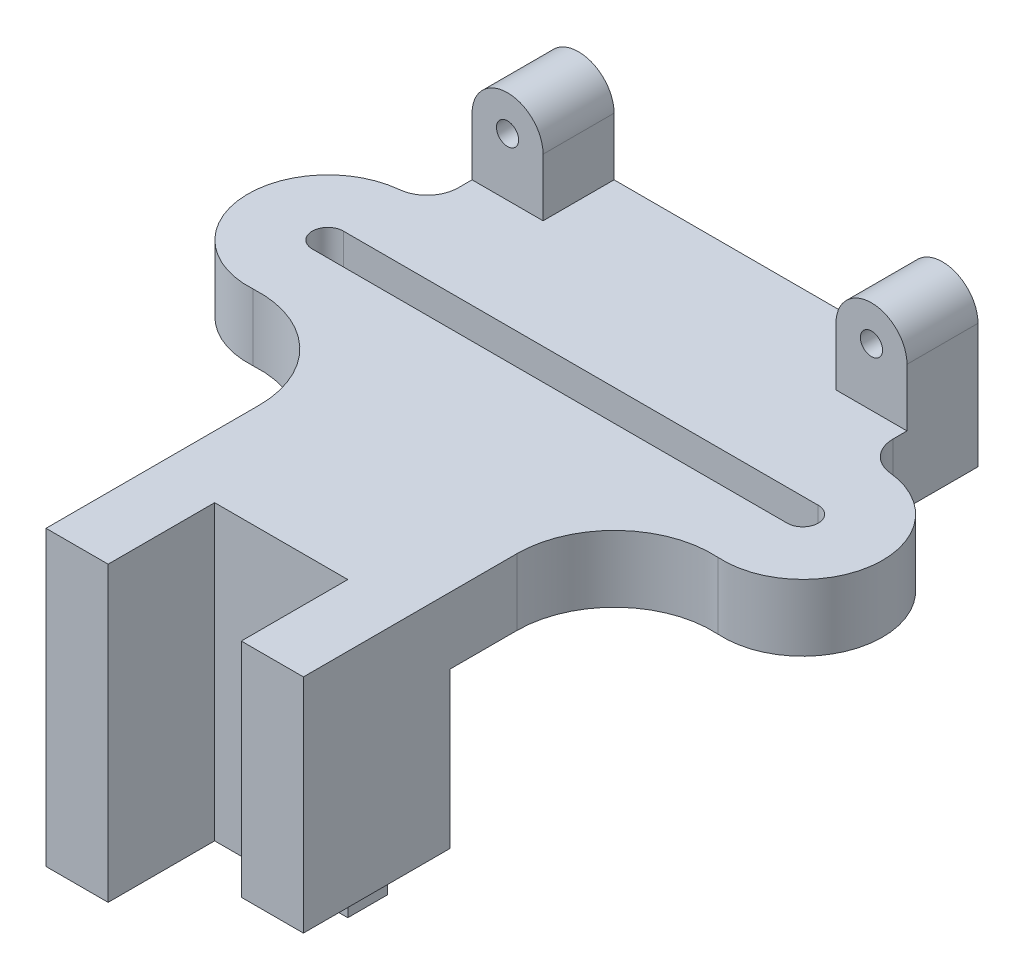
ISO-10303-21;
HEADER;
FILE_DESCRIPTION(('STEP AP214'),'2;1');
FILE_NAME('part.step','',(''),(''),'','','');
FILE_SCHEMA(('AUTOMOTIVE_DESIGN { 1 0 10303 214 1 1 1 1 }'));
ENDSEC;
DATA;
#1=APPLICATION_CONTEXT('core data for automotive mechanical design processes');
#2=APPLICATION_PROTOCOL_DEFINITION('international standard','automotive_design',2000,#1);
#3=PRODUCT_CONTEXT('',#1,'mechanical');
#4=PRODUCT('Part','Part','',(#3));
#5=PRODUCT_RELATED_PRODUCT_CATEGORY('part','',(#4));
#6=PRODUCT_DEFINITION_FORMATION('','',#4);
#7=PRODUCT_DEFINITION_CONTEXT('part definition',#1,'design');
#8=PRODUCT_DEFINITION('design','',#6,#7);
#9=PRODUCT_DEFINITION_SHAPE('','',#8);
#10=(LENGTH_UNIT() NAMED_UNIT(*) SI_UNIT(.MILLI.,.METRE.));
#11=(NAMED_UNIT(*) PLANE_ANGLE_UNIT() SI_UNIT($,.RADIAN.));
#12=(NAMED_UNIT(*) SI_UNIT($,.STERADIAN.) SOLID_ANGLE_UNIT());
#13=UNCERTAINTY_MEASURE_WITH_UNIT(LENGTH_MEASURE(1.E-05),#10,'distance_accuracy_value','');
#14=(GEOMETRIC_REPRESENTATION_CONTEXT(3) GLOBAL_UNCERTAINTY_ASSIGNED_CONTEXT((#13)) GLOBAL_UNIT_ASSIGNED_CONTEXT((#10,
#11,#12)) REPRESENTATION_CONTEXT('',''));
#15=CARTESIAN_POINT('',(0.,0.,0.));
#16=DIRECTION('',(0.,0.,1.));
#17=DIRECTION('',(1.,0.,0.));
#18=AXIS2_PLACEMENT_3D('',#15,#16,#17);
#19=CARTESIAN_POINT('',(15.,15.,132.));
#20=DIRECTION('',(0.,0.,-1.));
#21=DIRECTION('',(-1.,0.,0.));
#22=AXIS2_PLACEMENT_3D('',#19,#20,#21);
#23=PLANE('',#22);
#24=DIRECTION('',(-1.,0.,0.));
#25=VECTOR('',#24,1.);
#26=CARTESIAN_POINT('',(15.,-35.,132.));
#27=LINE('',#26,#25);
#28=CARTESIAN_POINT('',(29.,-35.,132.));
#29=VERTEX_POINT('',#28);
#30=CARTESIAN_POINT('',(15.,-35.,132.));
#31=VERTEX_POINT('',#30);
#32=EDGE_CURVE('E240',#29,#31,#27,.T.);
#33=ORIENTED_EDGE('',*,*,#32,.F.);
#34=DIRECTION('',(0.,-1.,0.));
#35=VECTOR('',#34,1.);
#36=CARTESIAN_POINT('',(29.,15.,132.));
#37=LINE('',#36,#35);
#38=CARTESIAN_POINT('',(29.,15.,132.));
#39=VERTEX_POINT('',#38);
#40=EDGE_CURVE('E261',#39,#29,#37,.T.);
#41=ORIENTED_EDGE('',*,*,#40,.F.);
#42=DIRECTION('',(1.,0.,0.));
#43=VECTOR('',#42,1.);
#44=CARTESIAN_POINT('',(15.,15.,132.));
#45=LINE('',#44,#43);
#46=CARTESIAN_POINT('',(15.,15.,132.));
#47=VERTEX_POINT('',#46);
#48=EDGE_CURVE('E257',#47,#39,#45,.T.);
#49=ORIENTED_EDGE('',*,*,#48,.F.);
#50=DIRECTION('',(0.,-1.,0.));
#51=VECTOR('',#50,1.);
#52=CARTESIAN_POINT('',(15.,15.,132.));
#53=LINE('',#52,#51);
#54=EDGE_CURVE('E254',#47,#31,#53,.T.);
#55=ORIENTED_EDGE('',*,*,#54,.T.);
#56=EDGE_LOOP('',(#33,#41,#49,#55));
#57=FACE_BOUND('',#56,.T.);
#58=ADVANCED_FACE('F41',(#57),#23,.F.);
#59=CARTESIAN_POINT('',(0.,-51.,0.));
#60=DIRECTION('',(0.,-1.,0.));
#61=DIRECTION('',(0.,0.,-1.));
#62=AXIS2_PLACEMENT_3D('',#59,#60,#61);
#63=PLANE('',#62);
#64=DIRECTION('',(1.,0.,0.));
#65=VECTOR('',#64,1.);
#66=CARTESIAN_POINT('',(29.,-51.,99.));
#67=LINE('',#66,#65);
#68=CARTESIAN_POINT('',(-29.,-51.,99.));
#69=VERTEX_POINT('',#68);
#70=CARTESIAN_POINT('',(15.,-51.,99.));
#71=VERTEX_POINT('',#70);
#72=EDGE_CURVE('E306',#69,#71,#67,.T.);
#73=ORIENTED_EDGE('',*,*,#72,.T.);
#74=DIRECTION('',(0.,0.,1.));
#75=VECTOR('',#74,1.);
#76=CARTESIAN_POINT('',(15.,-51.,0.));
#77=LINE('',#76,#75);
#78=CARTESIAN_POINT('',(15.,-51.,108.));
#79=VERTEX_POINT('',#78);
#80=EDGE_CURVE('E246',#71,#79,#77,.T.);
#81=ORIENTED_EDGE('',*,*,#80,.T.);
#82=DIRECTION('',(-1.,0.,0.));
#83=VECTOR('',#82,1.);
#84=CARTESIAN_POINT('',(-15.,-51.,108.));
#85=LINE('',#84,#83);
#86=CARTESIAN_POINT('',(-15.,-51.,108.));
#87=VERTEX_POINT('',#86);
#88=EDGE_CURVE('E302',#79,#87,#85,.T.);
#89=ORIENTED_EDGE('',*,*,#88,.T.);
#90=DIRECTION('',(0.,0.,1.));
#91=VECTOR('',#90,1.);
#92=CARTESIAN_POINT('',(-15.,-51.,132.));
#93=LINE('',#92,#91);
#94=CARTESIAN_POINT('',(-15.,-51.,132.));
#95=VERTEX_POINT('',#94);
#96=EDGE_CURVE('E321',#87,#95,#93,.T.);
#97=ORIENTED_EDGE('',*,*,#96,.T.);
#98=DIRECTION('',(-1.,0.,0.));
#99=VECTOR('',#98,1.);
#100=CARTESIAN_POINT('',(-29.,-51.,132.));
#101=LINE('',#100,#99);
#102=CARTESIAN_POINT('',(-29.,-51.,132.));
#103=VERTEX_POINT('',#102);
#104=EDGE_CURVE('E894',#95,#103,#101,.T.);
#105=ORIENTED_EDGE('',*,*,#104,.T.);
#106=DIRECTION('',(0.,0.,-1.));
#107=VECTOR('',#106,1.);
#108=CARTESIAN_POINT('',(-29.,-51.,99.));
#109=LINE('',#108,#107);
#110=EDGE_CURVE('E320',#103,#69,#109,.T.);
#111=ORIENTED_EDGE('',*,*,#110,.T.);
#112=EDGE_LOOP('',(#73,#81,#89,#97,#105,#111));
#113=FACE_BOUND('',#112,.T.);
#114=ADVANCED_FACE('F301',(#113),#63,.T.);
#115=CARTESIAN_POINT('',(29.,15.,132.));
#116=DIRECTION('',(-1.,0.,0.));
#117=DIRECTION('',(0.,0.,1.));
#118=AXIS2_PLACEMENT_3D('',#115,#116,#117);
#119=PLANE('',#118);
#120=DIRECTION('',(0.,0.,1.));
#121=VECTOR('',#120,1.);
#122=CARTESIAN_POINT('',(29.,-35.,0.));
#123=LINE('',#122,#121);
#124=CARTESIAN_POINT('',(29.,-35.,99.));
#125=VERTEX_POINT('',#124);
#126=EDGE_CURVE('E242',#125,#29,#123,.T.);
#127=ORIENTED_EDGE('',*,*,#126,.F.);
#128=DIRECTION('',(0.,1.,0.));
#129=VECTOR('',#128,1.);
#130=CARTESIAN_POINT('',(29.,-51.,99.));
#131=LINE('',#130,#129);
#132=CARTESIAN_POINT('',(29.,0.,99.));
#133=VERTEX_POINT('',#132);
#134=EDGE_CURVE('E311',#125,#133,#131,.T.);
#135=ORIENTED_EDGE('',*,*,#134,.T.);
#136=DIRECTION('',(0.,0.,-1.));
#137=VECTOR('',#136,1.);
#138=CARTESIAN_POINT('',(29.,0.,132.));
#139=LINE('',#138,#137);
#140=CARTESIAN_POINT('',(29.,0.,83.9217985566783));
#141=VERTEX_POINT('',#140);
#142=EDGE_CURVE('E461',#133,#141,#139,.T.);
#143=ORIENTED_EDGE('',*,*,#142,.T.);
#144=DIRECTION('',(0.,-1.,0.));
#145=VECTOR('',#144,1.);
#146=CARTESIAN_POINT('',(29.,15.,83.9217985566783));
#147=LINE('',#146,#145);
#148=CARTESIAN_POINT('',(29.,15.,83.9217985566783));
#149=VERTEX_POINT('',#148);
#150=EDGE_CURVE('E264',#149,#141,#147,.T.);
#151=ORIENTED_EDGE('',*,*,#150,.F.);
#152=DIRECTION('',(0.,0.,-1.));
#153=VECTOR('',#152,1.);
#154=CARTESIAN_POINT('',(29.,15.,132.));
#155=LINE('',#154,#153);
#156=EDGE_CURVE('E440',#39,#149,#155,.T.);
#157=ORIENTED_EDGE('',*,*,#156,.F.);
#158=ORIENTED_EDGE('',*,*,#40,.T.);
#159=EDGE_LOOP('',(#127,#135,#143,#151,#157,#158));
#160=FACE_BOUND('',#159,.T.);
#161=ADVANCED_FACE('F512',(#160),#119,.F.);
#162=CARTESIAN_POINT('',(-56.,15.,19.1253140723345));
#163=DIRECTION('',(0.,-1.,0.));
#164=DIRECTION('',(0.,0.,-1.));
#165=AXIS2_PLACEMENT_3D('',#162,#163,#164);
#166=PLANE('',#165);
#167=CARTESIAN_POINT('',(-53.5,15.,44.));
#168=DIRECTION('',(0.,1.,0.));
#169=DIRECTION('',(0.,0.,1.));
#170=AXIS2_PLACEMENT_3D('',#167,#168,#169);
#171=CIRCLE('',#170,3.5);
#172=CARTESIAN_POINT('',(-53.5,15.,40.5));
#173=VERTEX_POINT('',#172);
#174=CARTESIAN_POINT('',(-53.5,15.,47.5));
#175=VERTEX_POINT('',#174);
#176=EDGE_CURVE('E387',#173,#175,#171,.T.);
#177=ORIENTED_EDGE('',*,*,#176,.F.);
#178=DIRECTION('',(-1.,0.,0.));
#179=VECTOR('',#178,1.);
#180=CARTESIAN_POINT('',(-53.5,15.,40.5));
#181=LINE('',#180,#179);
#182=CARTESIAN_POINT('',(53.5,15.,40.5));
#183=VERTEX_POINT('',#182);
#184=EDGE_CURVE('E393',#183,#173,#181,.T.);
#185=ORIENTED_EDGE('',*,*,#184,.F.);
#186=CARTESIAN_POINT('',(53.5,15.,44.));
#187=DIRECTION('',(0.,1.,0.));
#188=DIRECTION('',(0.,0.,1.));
#189=AXIS2_PLACEMENT_3D('',#186,#187,#188);
#190=CIRCLE('',#189,3.50000000000001);
#191=CARTESIAN_POINT('',(53.5,15.,47.5));
#192=VERTEX_POINT('',#191);
#193=EDGE_CURVE('E391',#192,#183,#190,.T.);
#194=ORIENTED_EDGE('',*,*,#193,.F.);
#195=DIRECTION('',(1.,0.,0.));
#196=VECTOR('',#195,1.);
#197=CARTESIAN_POINT('',(-53.5,15.,47.5));
#198=LINE('',#197,#196);
#199=EDGE_CURVE('E389',#175,#192,#198,.T.);
#200=ORIENTED_EDGE('',*,*,#199,.F.);
#201=EDGE_LOOP('',(#177,#185,#194,#200));
#202=FACE_BOUND('',#201,.T.);
#203=DIRECTION('',(0.,0.,-1.));
#204=VECTOR('',#203,1.);
#205=CARTESIAN_POINT('',(-33.,15.,16.));
#206=LINE('',#205,#204);
#207=CARTESIAN_POINT('',(-33.,15.,16.));
#208=VERTEX_POINT('',#207);
#209=CARTESIAN_POINT('',(-33.,15.,0.));
#210=VERTEX_POINT('',#209);
#211=EDGE_CURVE('E355',#208,#210,#206,.T.);
#212=ORIENTED_EDGE('',*,*,#211,.F.);
#213=DIRECTION('',(1.,0.,0.));
#214=VECTOR('',#213,1.);
#215=CARTESIAN_POINT('',(-33.,15.,16.));
#216=LINE('',#215,#214);
#217=CARTESIAN_POINT('',(-49.,15.,16.));
#218=VERTEX_POINT('',#217);
#219=EDGE_CURVE('E333',#218,#208,#216,.T.);
#220=ORIENTED_EDGE('',*,*,#219,.F.);
#221=DIRECTION('',(0.,0.,1.));
#222=VECTOR('',#221,1.);
#223=CARTESIAN_POINT('',(-49.,15.,0.));
#224=LINE('',#223,#222);
#225=CARTESIAN_POINT('',(-49.,15.,19.1253140723345));
#226=VERTEX_POINT('',#225);
#227=EDGE_CURVE('E417',#218,#226,#224,.T.);
#228=ORIENTED_EDGE('',*,*,#227,.T.);
#229=CARTESIAN_POINT('',(-56.,15.,19.1253140723345));
#230=DIRECTION('',(0.,-1.,0.));
#231=DIRECTION('',(0.,0.,-1.));
#232=AXIS2_PLACEMENT_3D('',#229,#230,#231);
#233=CIRCLE('',#232,6.99999999999999);
#234=CARTESIAN_POINT('',(-55.3,15.,26.0902261320809));
#235=VERTEX_POINT('',#234);
#236=EDGE_CURVE('E420',#226,#235,#233,.T.);
#237=ORIENTED_EDGE('',*,*,#236,.T.);
#238=CARTESIAN_POINT('',(-53.5,15.,44.));
#239=DIRECTION('',(0.,1.,0.));
#240=DIRECTION('',(0.,0.,1.));
#241=AXIS2_PLACEMENT_3D('',#238,#239,#240);
#242=CIRCLE('',#241,18.);
#243=CARTESIAN_POINT('',(-52.375,15.,61.9648093505052));
#244=VERTEX_POINT('',#243);
#245=EDGE_CURVE('E425',#235,#244,#242,.T.);
#246=ORIENTED_EDGE('',*,*,#245,.T.);
#247=CARTESIAN_POINT('',(-51.,15.,83.9217985566783));
#248=DIRECTION('',(0.,-1.,0.));
#249=DIRECTION('',(0.,0.,-1.));
#250=AXIS2_PLACEMENT_3D('',#247,#248,#249);
#251=CIRCLE('',#250,22.);
#252=CARTESIAN_POINT('',(-29.,15.,83.9217985566783));
#253=VERTEX_POINT('',#252);
#254=EDGE_CURVE('E424',#244,#253,#251,.T.);
#255=ORIENTED_EDGE('',*,*,#254,.T.);
#256=DIRECTION('',(0.,0.,1.));
#257=VECTOR('',#256,1.);
#258=CARTESIAN_POINT('',(-29.,15.,83.9217985566783));
#259=LINE('',#258,#257);
#260=CARTESIAN_POINT('',(-29.,15.,132.));
#261=VERTEX_POINT('',#260);
#262=EDGE_CURVE('E426',#253,#261,#259,.T.);
#263=ORIENTED_EDGE('',*,*,#262,.T.);
#264=DIRECTION('',(1.,0.,0.));
#265=VECTOR('',#264,1.);
#266=CARTESIAN_POINT('',(-29.,15.,132.));
#267=LINE('',#266,#265);
#268=CARTESIAN_POINT('',(-15.,15.,132.));
#269=VERTEX_POINT('',#268);
#270=EDGE_CURVE('E428',#261,#269,#267,.T.);
#271=ORIENTED_EDGE('',*,*,#270,.T.);
#272=DIRECTION('',(0.,0.,-1.));
#273=VECTOR('',#272,1.);
#274=CARTESIAN_POINT('',(-15.,15.,132.));
#275=LINE('',#274,#273);
#276=CARTESIAN_POINT('',(-15.,15.,108.));
#277=VERTEX_POINT('',#276);
#278=EDGE_CURVE('E429',#269,#277,#275,.T.);
#279=ORIENTED_EDGE('',*,*,#278,.T.);
#280=DIRECTION('',(1.,0.,0.));
#281=VECTOR('',#280,1.);
#282=CARTESIAN_POINT('',(-15.,15.,108.));
#283=LINE('',#282,#281);
#284=CARTESIAN_POINT('',(15.,15.,108.));
#285=VERTEX_POINT('',#284);
#286=EDGE_CURVE('E435',#277,#285,#283,.T.);
#287=ORIENTED_EDGE('',*,*,#286,.T.);
#288=DIRECTION('',(0.,0.,1.));
#289=VECTOR('',#288,1.);
#290=CARTESIAN_POINT('',(15.,15.,108.));
#291=LINE('',#290,#289);
#292=EDGE_CURVE('E432',#285,#47,#291,.T.);
#293=ORIENTED_EDGE('',*,*,#292,.T.);
#294=ORIENTED_EDGE('',*,*,#48,.T.);
#295=ORIENTED_EDGE('',*,*,#156,.T.);
#296=CARTESIAN_POINT('',(51.,15.,83.9217985566783));
#297=DIRECTION('',(0.,-1.,0.));
#298=DIRECTION('',(0.,0.,-1.));
#299=AXIS2_PLACEMENT_3D('',#296,#297,#298);
#300=CIRCLE('',#299,22.);
#301=CARTESIAN_POINT('',(52.375,15.,61.9648093505052));
#302=VERTEX_POINT('',#301);
#303=EDGE_CURVE('E438',#149,#302,#300,.T.);
#304=ORIENTED_EDGE('',*,*,#303,.T.);
#305=CARTESIAN_POINT('',(53.5,15.,44.));
#306=DIRECTION('',(0.,1.,0.));
#307=DIRECTION('',(0.,0.,-1.));
#308=AXIS2_PLACEMENT_3D('',#305,#306,#307);
#309=CIRCLE('',#308,18.);
#310=CARTESIAN_POINT('',(55.3,15.,26.0902261320808));
#311=VERTEX_POINT('',#310);
#312=EDGE_CURVE('E442',#302,#311,#309,.T.);
#313=ORIENTED_EDGE('',*,*,#312,.T.);
#314=CARTESIAN_POINT('',(56.,15.,19.1253140723345));
#315=DIRECTION('',(0.,-1.,0.));
#316=DIRECTION('',(0.,0.,1.));
#317=AXIS2_PLACEMENT_3D('',#314,#315,#316);
#318=CIRCLE('',#317,7.);
#319=CARTESIAN_POINT('',(49.,15.,19.1253140723345));
#320=VERTEX_POINT('',#319);
#321=EDGE_CURVE('E444',#311,#320,#318,.T.);
#322=ORIENTED_EDGE('',*,*,#321,.T.);
#323=DIRECTION('',(0.,0.,-1.));
#324=VECTOR('',#323,1.);
#325=CARTESIAN_POINT('',(49.,15.,0.));
#326=LINE('',#325,#324);
#327=CARTESIAN_POINT('',(49.,15.,16.));
#328=VERTEX_POINT('',#327);
#329=EDGE_CURVE('E443',#320,#328,#326,.T.);
#330=ORIENTED_EDGE('',*,*,#329,.T.);
#331=DIRECTION('',(1.,0.,0.));
#332=VECTOR('',#331,1.);
#333=CARTESIAN_POINT('',(33.,15.,16.));
#334=LINE('',#333,#332);
#335=CARTESIAN_POINT('',(33.,15.,16.));
#336=VERTEX_POINT('',#335);
#337=EDGE_CURVE('E376',#336,#328,#334,.T.);
#338=ORIENTED_EDGE('',*,*,#337,.F.);
#339=DIRECTION('',(0.,0.,-1.));
#340=VECTOR('',#339,1.);
#341=CARTESIAN_POINT('',(33.,15.,16.));
#342=LINE('',#341,#340);
#343=CARTESIAN_POINT('',(33.,15.,0.));
#344=VERTEX_POINT('',#343);
#345=EDGE_CURVE('E363',#336,#344,#342,.T.);
#346=ORIENTED_EDGE('',*,*,#345,.T.);
#347=DIRECTION('',(-1.,0.,0.));
#348=VECTOR('',#347,1.);
#349=CARTESIAN_POINT('',(49.,15.,0.));
#350=LINE('',#349,#348);
#351=EDGE_CURVE('E449',#344,#210,#350,.T.);
#352=ORIENTED_EDGE('',*,*,#351,.T.);
#353=EDGE_LOOP('',(#212,#220,#228,#237,#246,#255,#263,#271,#279,#287,#293,#294,#295,#304,#313,
#322,#330,#338,#346,#352));
#354=FACE_BOUND('',#353,.T.);
#355=ADVANCED_FACE('F509',(#202,#354),#166,.F.);
#356=CARTESIAN_POINT('',(-56.,0.,19.1253140723345));
#357=DIRECTION('',(0.,-1.,0.));
#358=DIRECTION('',(0.,0.,-1.));
#359=AXIS2_PLACEMENT_3D('',#356,#357,#358);
#360=PLANE('',#359);
#361=DIRECTION('',(1.,0.,0.));
#362=VECTOR('',#361,1.);
#363=CARTESIAN_POINT('',(29.,0.,99.));
#364=LINE('',#363,#362);
#365=CARTESIAN_POINT('',(-29.,0.,99.));
#366=VERTEX_POINT('',#365);
#367=EDGE_CURVE('E68',#366,#133,#364,.T.);
#368=ORIENTED_EDGE('',*,*,#367,.F.);
#369=DIRECTION('',(0.,0.,1.));
#370=VECTOR('',#369,1.);
#371=CARTESIAN_POINT('',(-29.,0.,83.9217985566783));
#372=LINE('',#371,#370);
#373=CARTESIAN_POINT('',(-29.,0.,83.9217985566783));
#374=VERTEX_POINT('',#373);
#375=EDGE_CURVE('E459',#374,#366,#372,.T.);
#376=ORIENTED_EDGE('',*,*,#375,.F.);
#377=CARTESIAN_POINT('',(-51.,0.,83.9217985566783));
#378=DIRECTION('',(0.,-1.,0.));
#379=DIRECTION('',(0.,0.,-1.));
#380=AXIS2_PLACEMENT_3D('',#377,#378,#379);
#381=CIRCLE('',#380,22.);
#382=CARTESIAN_POINT('',(-52.375,0.,61.9648093505052));
#383=VERTEX_POINT('',#382);
#384=EDGE_CURVE('E460',#383,#374,#381,.T.);
#385=ORIENTED_EDGE('',*,*,#384,.F.);
#386=CARTESIAN_POINT('',(-53.5,0.,44.));
#387=DIRECTION('',(0.,1.,0.));
#388=DIRECTION('',(0.,0.,1.));
#389=AXIS2_PLACEMENT_3D('',#386,#387,#388);
#390=CIRCLE('',#389,18.);
#391=CARTESIAN_POINT('',(-55.3,0.,26.0902261320809));
#392=VERTEX_POINT('',#391);
#393=EDGE_CURVE('E452',#392,#383,#390,.T.);
#394=ORIENTED_EDGE('',*,*,#393,.F.);
#395=CARTESIAN_POINT('',(-56.,0.,19.1253140723345));
#396=DIRECTION('',(0.,-1.,0.));
#397=DIRECTION('',(0.,0.,-1.));
#398=AXIS2_PLACEMENT_3D('',#395,#396,#397);
#399=CIRCLE('',#398,6.99999999999999);
#400=CARTESIAN_POINT('',(-49.,0.,19.1253140723345));
#401=VERTEX_POINT('',#400);
#402=EDGE_CURVE('E451',#401,#392,#399,.T.);
#403=ORIENTED_EDGE('',*,*,#402,.F.);
#404=DIRECTION('',(0.,0.,1.));
#405=VECTOR('',#404,1.);
#406=CARTESIAN_POINT('',(-49.,0.,0.));
#407=LINE('',#406,#405);
#408=CARTESIAN_POINT('',(-49.,0.,0.));
#409=VERTEX_POINT('',#408);
#410=EDGE_CURVE('E418',#409,#401,#407,.T.);
#411=ORIENTED_EDGE('',*,*,#410,.F.);
#412=DIRECTION('',(-1.,0.,0.));
#413=VECTOR('',#412,1.);
#414=CARTESIAN_POINT('',(49.,0.,0.));
#415=LINE('',#414,#413);
#416=CARTESIAN_POINT('',(49.,0.,0.));
#417=VERTEX_POINT('',#416);
#418=EDGE_CURVE('E419',#417,#409,#415,.T.);
#419=ORIENTED_EDGE('',*,*,#418,.F.);
#420=DIRECTION('',(0.,0.,-1.));
#421=VECTOR('',#420,1.);
#422=CARTESIAN_POINT('',(49.,0.,0.));
#423=LINE('',#422,#421);
#424=CARTESIAN_POINT('',(49.,0.,19.1253140723345));
#425=VERTEX_POINT('',#424);
#426=EDGE_CURVE('E469',#425,#417,#423,.T.);
#427=ORIENTED_EDGE('',*,*,#426,.F.);
#428=CARTESIAN_POINT('',(56.,0.,19.1253140723345));
#429=DIRECTION('',(0.,-1.,0.));
#430=DIRECTION('',(0.,0.,1.));
#431=AXIS2_PLACEMENT_3D('',#428,#429,#430);
#432=CIRCLE('',#431,7.);
#433=CARTESIAN_POINT('',(55.3,0.,26.0902261320808));
#434=VERTEX_POINT('',#433);
#435=EDGE_CURVE('E470',#434,#425,#432,.T.);
#436=ORIENTED_EDGE('',*,*,#435,.F.);
#437=CARTESIAN_POINT('',(53.5,0.,44.));
#438=DIRECTION('',(0.,1.,0.));
#439=DIRECTION('',(0.,0.,-1.));
#440=AXIS2_PLACEMENT_3D('',#437,#438,#439);
#441=CIRCLE('',#440,18.);
#442=CARTESIAN_POINT('',(52.375,0.,61.9648093505052));
#443=VERTEX_POINT('',#442);
#444=EDGE_CURVE('E465',#443,#434,#441,.T.);
#445=ORIENTED_EDGE('',*,*,#444,.F.);
#446=CARTESIAN_POINT('',(51.,0.,83.9217985566783));
#447=DIRECTION('',(0.,-1.,0.));
#448=DIRECTION('',(0.,0.,-1.));
#449=AXIS2_PLACEMENT_3D('',#446,#447,#448);
#450=CIRCLE('',#449,22.);
#451=EDGE_CURVE('E464',#141,#443,#450,.T.);
#452=ORIENTED_EDGE('',*,*,#451,.F.);
#453=ORIENTED_EDGE('',*,*,#142,.F.);
#454=EDGE_LOOP('',(#368,#376,#385,#394,#403,#411,#419,#427,#436,#445,#452,#453));
#455=FACE_BOUND('',#454,.T.);
#456=DIRECTION('',(-1.,0.,0.));
#457=VECTOR('',#456,1.);
#458=CARTESIAN_POINT('',(-53.5,0.,40.5));
#459=LINE('',#458,#457);
#460=CARTESIAN_POINT('',(53.5,0.,40.5));
#461=VERTEX_POINT('',#460);
#462=CARTESIAN_POINT('',(-53.5,0.,40.5));
#463=VERTEX_POINT('',#462);
#464=EDGE_CURVE('E386',#461,#463,#459,.T.);
#465=ORIENTED_EDGE('',*,*,#464,.T.);
#466=CARTESIAN_POINT('',(-53.5,0.,44.));
#467=DIRECTION('',(0.,1.,0.));
#468=DIRECTION('',(0.,0.,1.));
#469=AXIS2_PLACEMENT_3D('',#466,#467,#468);
#470=CIRCLE('',#469,3.5);
#471=CARTESIAN_POINT('',(-53.5,0.,47.5));
#472=VERTEX_POINT('',#471);
#473=EDGE_CURVE('E356',#463,#472,#470,.T.);
#474=ORIENTED_EDGE('',*,*,#473,.T.);
#475=DIRECTION('',(1.,0.,0.));
#476=VECTOR('',#475,1.);
#477=CARTESIAN_POINT('',(-53.5,0.,47.5));
#478=LINE('',#477,#476);
#479=CARTESIAN_POINT('',(53.5,0.,47.5));
#480=VERTEX_POINT('',#479);
#481=EDGE_CURVE('E399',#472,#480,#478,.T.);
#482=ORIENTED_EDGE('',*,*,#481,.T.);
#483=CARTESIAN_POINT('',(53.5,0.,44.));
#484=DIRECTION('',(0.,1.,0.));
#485=DIRECTION('',(0.,0.,1.));
#486=AXIS2_PLACEMENT_3D('',#483,#484,#485);
#487=CIRCLE('',#486,3.50000000000001);
#488=EDGE_CURVE('E405',#480,#461,#487,.T.);
#489=ORIENTED_EDGE('',*,*,#488,.T.);
#490=EDGE_LOOP('',(#465,#474,#482,#489));
#491=FACE_BOUND('',#490,.T.);
#492=ADVANCED_FACE('F494',(#455,#491),#360,.T.);
#493=CARTESIAN_POINT('',(-49.,15.,0.));
#494=DIRECTION('',(1.,0.,0.));
#495=DIRECTION('',(0.,0.,-1.));
#496=AXIS2_PLACEMENT_3D('',#493,#494,#495);
#497=PLANE('',#496);
#498=ORIENTED_EDGE('',*,*,#410,.T.);
#499=DIRECTION('',(0.,-1.,0.));
#500=VECTOR('',#499,1.);
#501=CARTESIAN_POINT('',(-49.,15.,19.1253140723345));
#502=LINE('',#501,#500);
#503=EDGE_CURVE('E284',#226,#401,#502,.T.);
#504=ORIENTED_EDGE('',*,*,#503,.F.);
#505=ORIENTED_EDGE('',*,*,#227,.F.);
#506=DIRECTION('',(0.,-1.,0.));
#507=VECTOR('',#506,1.);
#508=CARTESIAN_POINT('',(-49.,15.,16.));
#509=LINE('',#508,#507);
#510=CARTESIAN_POINT('',(-49.,28.,16.));
#511=VERTEX_POINT('',#510);
#512=EDGE_CURVE('E341',#511,#218,#509,.T.);
#513=ORIENTED_EDGE('',*,*,#512,.F.);
#514=DIRECTION('',(0.,0.,-1.));
#515=VECTOR('',#514,1.);
#516=CARTESIAN_POINT('',(-49.,28.,16.));
#517=LINE('',#516,#515);
#518=CARTESIAN_POINT('',(-49.,28.,0.));
#519=VERTEX_POINT('',#518);
#520=EDGE_CURVE('E347',#511,#519,#517,.T.);
#521=ORIENTED_EDGE('',*,*,#520,.T.);
#522=DIRECTION('',(0.,-1.,0.));
#523=VECTOR('',#522,1.);
#524=CARTESIAN_POINT('',(-49.,15.,0.));
#525=LINE('',#524,#523);
#526=EDGE_CURVE('E450',#519,#409,#525,.T.);
#527=ORIENTED_EDGE('',*,*,#526,.T.);
#528=EDGE_LOOP('',(#498,#504,#505,#513,#521,#527));
#529=FACE_BOUND('',#528,.T.);
#530=ADVANCED_FACE('F43',(#529),#497,.F.);
#531=CARTESIAN_POINT('',(-56.,15.,19.1253140723345));
#532=DIRECTION('',(0.,-1.,0.));
#533=DIRECTION('',(0.,0.,-1.));
#534=AXIS2_PLACEMENT_3D('',#531,#532,#533);
#535=CYLINDRICAL_SURFACE('',#534,6.99999999999999);
#536=ORIENTED_EDGE('',*,*,#402,.T.);
#537=DIRECTION('',(0.,-1.,0.));
#538=VECTOR('',#537,1.);
#539=CARTESIAN_POINT('',(-55.3,15.,26.0902261320809));
#540=LINE('',#539,#538);
#541=EDGE_CURVE('E278',#235,#392,#540,.T.);
#542=ORIENTED_EDGE('',*,*,#541,.F.);
#543=ORIENTED_EDGE('',*,*,#236,.F.);
#544=ORIENTED_EDGE('',*,*,#503,.T.);
#545=EDGE_LOOP('',(#536,#542,#543,#544));
#546=FACE_BOUND('',#545,.T.);
#547=ADVANCED_FACE('F532',(#546),#535,.F.);
#548=CARTESIAN_POINT('',(-53.5,15.,44.));
#549=DIRECTION('',(0.,-1.,0.));
#550=DIRECTION('',(0.,0.,-1.));
#551=AXIS2_PLACEMENT_3D('',#548,#549,#550);
#552=CYLINDRICAL_SURFACE('',#551,18.);
#553=ORIENTED_EDGE('',*,*,#393,.T.);
#554=DIRECTION('',(0.,-1.,0.));
#555=VECTOR('',#554,1.);
#556=CARTESIAN_POINT('',(-52.375,15.,61.9648093505052));
#557=LINE('',#556,#555);
#558=EDGE_CURVE('E280',#244,#383,#557,.T.);
#559=ORIENTED_EDGE('',*,*,#558,.F.);
#560=ORIENTED_EDGE('',*,*,#245,.F.);
#561=ORIENTED_EDGE('',*,*,#541,.T.);
#562=EDGE_LOOP('',(#553,#559,#560,#561));
#563=FACE_BOUND('',#562,.T.);
#564=ADVANCED_FACE('F533',(#563),#552,.T.);
#565=CARTESIAN_POINT('',(-51.,15.,83.9217985566783));
#566=DIRECTION('',(0.,-1.,0.));
#567=DIRECTION('',(0.,0.,-1.));
#568=AXIS2_PLACEMENT_3D('',#565,#566,#567);
#569=CYLINDRICAL_SURFACE('',#568,22.);
#570=ORIENTED_EDGE('',*,*,#384,.T.);
#571=DIRECTION('',(0.,-1.,0.));
#572=VECTOR('',#571,1.);
#573=CARTESIAN_POINT('',(-29.,15.,83.9217985566783));
#574=LINE('',#573,#572);
#575=EDGE_CURVE('E273',#253,#374,#574,.T.);
#576=ORIENTED_EDGE('',*,*,#575,.F.);
#577=ORIENTED_EDGE('',*,*,#254,.F.);
#578=ORIENTED_EDGE('',*,*,#558,.T.);
#579=EDGE_LOOP('',(#570,#576,#577,#578));
#580=FACE_BOUND('',#579,.T.);
#581=ADVANCED_FACE('F528',(#580),#569,.F.);
#582=CARTESIAN_POINT('',(-29.,15.,83.9217985566783));
#583=DIRECTION('',(1.,0.,0.));
#584=DIRECTION('',(0.,0.,-1.));
#585=AXIS2_PLACEMENT_3D('',#582,#583,#584);
#586=PLANE('',#585);
#587=ORIENTED_EDGE('',*,*,#375,.T.);
#588=DIRECTION('',(0.,1.,0.));
#589=VECTOR('',#588,1.);
#590=CARTESIAN_POINT('',(-29.,-51.,99.));
#591=LINE('',#590,#589);
#592=EDGE_CURVE('E312',#69,#366,#591,.T.);
#593=ORIENTED_EDGE('',*,*,#592,.F.);
#594=ORIENTED_EDGE('',*,*,#110,.F.);
#595=DIRECTION('',(0.,-1.,0.));
#596=VECTOR('',#595,1.);
#597=CARTESIAN_POINT('',(-29.,15.,132.));
#598=LINE('',#597,#596);
#599=EDGE_CURVE('E275',#261,#103,#598,.T.);
#600=ORIENTED_EDGE('',*,*,#599,.F.);
#601=ORIENTED_EDGE('',*,*,#262,.F.);
#602=ORIENTED_EDGE('',*,*,#575,.T.);
#603=EDGE_LOOP('',(#587,#593,#594,#600,#601,#602));
#604=FACE_BOUND('',#603,.T.);
#605=ADVANCED_FACE('F518',(#604),#586,.F.);
#606=CARTESIAN_POINT('',(-29.,15.,132.));
#607=DIRECTION('',(0.,0.,-1.));
#608=DIRECTION('',(-1.,0.,0.));
#609=AXIS2_PLACEMENT_3D('',#606,#607,#608);
#610=PLANE('',#609);
#611=ORIENTED_EDGE('',*,*,#599,.T.);
#612=ORIENTED_EDGE('',*,*,#104,.F.);
#613=DIRECTION('',(0.,-1.,0.));
#614=VECTOR('',#613,1.);
#615=CARTESIAN_POINT('',(-15.,15.,132.));
#616=LINE('',#615,#614);
#617=EDGE_CURVE('E269',#269,#95,#616,.T.);
#618=ORIENTED_EDGE('',*,*,#617,.F.);
#619=ORIENTED_EDGE('',*,*,#270,.F.);
#620=EDGE_LOOP('',(#611,#612,#618,#619));
#621=FACE_BOUND('',#620,.T.);
#622=ADVANCED_FACE('F616',(#621),#610,.F.);
#623=CARTESIAN_POINT('',(-15.,15.,132.));
#624=DIRECTION('',(-1.,0.,0.));
#625=DIRECTION('',(0.,0.,1.));
#626=AXIS2_PLACEMENT_3D('',#623,#624,#625);
#627=PLANE('',#626);
#628=ORIENTED_EDGE('',*,*,#617,.T.);
#629=ORIENTED_EDGE('',*,*,#96,.F.);
#630=DIRECTION('',(0.,-1.,0.));
#631=VECTOR('',#630,1.);
#632=CARTESIAN_POINT('',(-15.,15.,108.));
#633=LINE('',#632,#631);
#634=EDGE_CURVE('E263',#277,#87,#633,.T.);
#635=ORIENTED_EDGE('',*,*,#634,.F.);
#636=ORIENTED_EDGE('',*,*,#278,.F.);
#637=EDGE_LOOP('',(#628,#629,#635,#636));
#638=FACE_BOUND('',#637,.T.);
#639=ADVANCED_FACE('F615',(#638),#627,.F.);
#640=CARTESIAN_POINT('',(-15.,15.,108.));
#641=DIRECTION('',(0.,0.,-1.));
#642=DIRECTION('',(-1.,0.,0.));
#643=AXIS2_PLACEMENT_3D('',#640,#641,#642);
#644=PLANE('',#643);
#645=CARTESIAN_POINT('',(0.,-18.,108.));
#646=DIRECTION('',(0.,0.,-1.));
#647=DIRECTION('',(-1.,0.,0.));
#648=AXIS2_PLACEMENT_3D('',#645,#646,#647);
#649=CIRCLE('',#648,4.5);
#650=CARTESIAN_POINT('',(-4.5,-18.,108.));
#651=VERTEX_POINT('',#650);
#652=EDGE_CURVE('E325',#651,#651,#649,.T.);
#653=ORIENTED_EDGE('',*,*,#652,.T.);
#654=EDGE_LOOP('',(#653));
#655=FACE_BOUND('',#654,.T.);
#656=CARTESIAN_POINT('',(0.,-40.,108.));
#657=DIRECTION('',(0.,0.,-1.));
#658=DIRECTION('',(-1.,0.,0.));
#659=AXIS2_PLACEMENT_3D('',#656,#657,#658);
#660=CIRCLE('',#659,4.5);
#661=CARTESIAN_POINT('',(-4.5,-40.,108.));
#662=VERTEX_POINT('',#661);
#663=EDGE_CURVE('E289',#662,#662,#660,.T.);
#664=ORIENTED_EDGE('',*,*,#663,.T.);
#665=EDGE_LOOP('',(#664));
#666=FACE_BOUND('',#665,.T.);
#667=ORIENTED_EDGE('',*,*,#634,.T.);
#668=ORIENTED_EDGE('',*,*,#88,.F.);
#669=DIRECTION('',(0.,-1.,0.));
#670=VECTOR('',#669,1.);
#671=CARTESIAN_POINT('',(15.,15.,108.));
#672=LINE('',#671,#670);
#673=CARTESIAN_POINT('',(15.,-35.,108.));
#674=VERTEX_POINT('',#673);
#675=EDGE_CURVE('E250',#674,#79,#672,.T.);
#676=ORIENTED_EDGE('',*,*,#675,.F.);
#677=EDGE_CURVE('E256',#285,#674,#672,.T.);
#678=ORIENTED_EDGE('',*,*,#677,.F.);
#679=ORIENTED_EDGE('',*,*,#286,.F.);
#680=EDGE_LOOP('',(#667,#668,#676,#678,#679));
#681=FACE_BOUND('',#680,.T.);
#682=ADVANCED_FACE('F309',(#655,#666,#681),#644,.F.);
#683=CARTESIAN_POINT('',(15.,15.,108.));
#684=DIRECTION('',(1.,0.,0.));
#685=DIRECTION('',(0.,0.,-1.));
#686=AXIS2_PLACEMENT_3D('',#683,#684,#685);
#687=PLANE('',#686);
#688=ORIENTED_EDGE('',*,*,#677,.T.);
#689=DIRECTION('',(0.,0.,1.));
#690=VECTOR('',#689,1.);
#691=CARTESIAN_POINT('',(15.,-35.,0.));
#692=LINE('',#691,#690);
#693=EDGE_CURVE('E238',#674,#31,#692,.T.);
#694=ORIENTED_EDGE('',*,*,#693,.T.);
#695=ORIENTED_EDGE('',*,*,#54,.F.);
#696=ORIENTED_EDGE('',*,*,#292,.F.);
#697=EDGE_LOOP('',(#688,#694,#695,#696));
#698=FACE_BOUND('',#697,.T.);
#699=ADVANCED_FACE('F251',(#698),#687,.F.);
#700=CARTESIAN_POINT('',(51.,15.,83.9217985566783));
#701=DIRECTION('',(0.,-1.,0.));
#702=DIRECTION('',(0.,0.,-1.));
#703=AXIS2_PLACEMENT_3D('',#700,#701,#702);
#704=CYLINDRICAL_SURFACE('',#703,22.);
#705=ORIENTED_EDGE('',*,*,#451,.T.);
#706=DIRECTION('',(0.,-1.,0.));
#707=VECTOR('',#706,1.);
#708=CARTESIAN_POINT('',(52.375,15.,61.9648093505052));
#709=LINE('',#708,#707);
#710=EDGE_CURVE('E483',#302,#443,#709,.T.);
#711=ORIENTED_EDGE('',*,*,#710,.F.);
#712=ORIENTED_EDGE('',*,*,#303,.F.);
#713=ORIENTED_EDGE('',*,*,#150,.T.);
#714=EDGE_LOOP('',(#705,#711,#712,#713));
#715=FACE_BOUND('',#714,.T.);
#716=ADVANCED_FACE('F489',(#715),#704,.F.);
#717=CARTESIAN_POINT('',(53.5,15.,44.));
#718=DIRECTION('',(0.,-1.,0.));
#719=DIRECTION('',(0.,0.,-1.));
#720=AXIS2_PLACEMENT_3D('',#717,#718,#719);
#721=CYLINDRICAL_SURFACE('',#720,18.);
#722=ORIENTED_EDGE('',*,*,#444,.T.);
#723=DIRECTION('',(0.,-1.,0.));
#724=VECTOR('',#723,1.);
#725=CARTESIAN_POINT('',(55.3,15.,26.0902261320808));
#726=LINE('',#725,#724);
#727=EDGE_CURVE('E477',#311,#434,#726,.T.);
#728=ORIENTED_EDGE('',*,*,#727,.F.);
#729=ORIENTED_EDGE('',*,*,#312,.F.);
#730=ORIENTED_EDGE('',*,*,#710,.T.);
#731=EDGE_LOOP('',(#722,#728,#729,#730));
#732=FACE_BOUND('',#731,.T.);
#733=ADVANCED_FACE('F501',(#732),#721,.T.);
#734=CARTESIAN_POINT('',(56.,15.,19.1253140723345));
#735=DIRECTION('',(0.,-1.,0.));
#736=DIRECTION('',(0.,0.,-1.));
#737=AXIS2_PLACEMENT_3D('',#734,#735,#736);
#738=CYLINDRICAL_SURFACE('',#737,7.);
#739=ORIENTED_EDGE('',*,*,#435,.T.);
#740=DIRECTION('',(0.,-1.,0.));
#741=VECTOR('',#740,1.);
#742=CARTESIAN_POINT('',(49.,15.,19.1253140723345));
#743=LINE('',#742,#741);
#744=EDGE_CURVE('E480',#320,#425,#743,.T.);
#745=ORIENTED_EDGE('',*,*,#744,.F.);
#746=ORIENTED_EDGE('',*,*,#321,.F.);
#747=ORIENTED_EDGE('',*,*,#727,.T.);
#748=EDGE_LOOP('',(#739,#745,#746,#747));
#749=FACE_BOUND('',#748,.T.);
#750=ADVANCED_FACE('F505',(#749),#738,.F.);
#751=CARTESIAN_POINT('',(49.,15.,0.));
#752=DIRECTION('',(-1.,0.,0.));
#753=DIRECTION('',(0.,0.,1.));
#754=AXIS2_PLACEMENT_3D('',#751,#752,#753);
#755=PLANE('',#754);
#756=ORIENTED_EDGE('',*,*,#426,.T.);
#757=DIRECTION('',(0.,-1.,0.));
#758=VECTOR('',#757,1.);
#759=CARTESIAN_POINT('',(49.,15.,0.));
#760=LINE('',#759,#758);
#761=CARTESIAN_POINT('',(49.,28.,0.));
#762=VERTEX_POINT('',#761);
#763=EDGE_CURVE('E475',#762,#417,#760,.T.);
#764=ORIENTED_EDGE('',*,*,#763,.F.);
#765=DIRECTION('',(0.,0.,-1.));
#766=VECTOR('',#765,1.);
#767=CARTESIAN_POINT('',(49.,28.,16.));
#768=LINE('',#767,#766);
#769=CARTESIAN_POINT('',(49.,28.,16.));
#770=VERTEX_POINT('',#769);
#771=EDGE_CURVE('E365',#770,#762,#768,.T.);
#772=ORIENTED_EDGE('',*,*,#771,.F.);
#773=DIRECTION('',(0.,1.,0.));
#774=VECTOR('',#773,1.);
#775=CARTESIAN_POINT('',(49.,15.,16.));
#776=LINE('',#775,#774);
#777=EDGE_CURVE('E370',#328,#770,#776,.T.);
#778=ORIENTED_EDGE('',*,*,#777,.F.);
#779=ORIENTED_EDGE('',*,*,#329,.F.);
#780=ORIENTED_EDGE('',*,*,#744,.T.);
#781=EDGE_LOOP('',(#756,#764,#772,#778,#779,#780));
#782=FACE_BOUND('',#781,.T.);
#783=ADVANCED_FACE('F567',(#782),#755,.F.);
#784=CARTESIAN_POINT('',(49.,15.,0.));
#785=DIRECTION('',(0.,0.,1.));
#786=DIRECTION('',(1.,0.,0.));
#787=AXIS2_PLACEMENT_3D('',#784,#785,#786);
#788=PLANE('',#787);
#789=ORIENTED_EDGE('',*,*,#418,.T.);
#790=ORIENTED_EDGE('',*,*,#526,.F.);
#791=CARTESIAN_POINT('',(-41.,28.,0.));
#792=DIRECTION('',(0.,0.,1.));
#793=DIRECTION('',(-1.,0.,0.));
#794=AXIS2_PLACEMENT_3D('',#791,#792,#793);
#795=CIRCLE('',#794,8.);
#796=CARTESIAN_POINT('',(-33.,28.,0.));
#797=VERTEX_POINT('',#796);
#798=EDGE_CURVE('E338',#797,#519,#795,.T.);
#799=ORIENTED_EDGE('',*,*,#798,.F.);
#800=DIRECTION('',(0.,1.,0.));
#801=VECTOR('',#800,1.);
#802=CARTESIAN_POINT('',(-33.,28.,0.));
#803=LINE('',#802,#801);
#804=EDGE_CURVE('E329',#210,#797,#803,.T.);
#805=ORIENTED_EDGE('',*,*,#804,.F.);
#806=ORIENTED_EDGE('',*,*,#351,.F.);
#807=DIRECTION('',(0.,-1.,0.));
#808=VECTOR('',#807,1.);
#809=CARTESIAN_POINT('',(33.,28.,0.));
#810=LINE('',#809,#808);
#811=CARTESIAN_POINT('',(33.,28.,0.));
#812=VERTEX_POINT('',#811);
#813=EDGE_CURVE('E366',#812,#344,#810,.T.);
#814=ORIENTED_EDGE('',*,*,#813,.F.);
#815=CARTESIAN_POINT('',(41.,28.,0.));
#816=DIRECTION('',(0.,0.,1.));
#817=DIRECTION('',(1.,0.,0.));
#818=AXIS2_PLACEMENT_3D('',#815,#816,#817);
#819=CIRCLE('',#818,8.);
#820=EDGE_CURVE('E367',#762,#812,#819,.T.);
#821=ORIENTED_EDGE('',*,*,#820,.F.);
#822=ORIENTED_EDGE('',*,*,#763,.T.);
#823=EDGE_LOOP('',(#789,#790,#799,#805,#806,#814,#821,#822));
#824=FACE_BOUND('',#823,.T.);
#825=CARTESIAN_POINT('',(41.,28.,0.));
#826=DIRECTION('',(0.,0.,1.));
#827=DIRECTION('',(-1.,0.,0.));
#828=AXIS2_PLACEMENT_3D('',#825,#826,#827);
#829=CIRCLE('',#828,2.5);
#830=CARTESIAN_POINT('',(38.5,28.,0.));
#831=VERTEX_POINT('',#830);
#832=EDGE_CURVE('E331',#831,#831,#829,.T.);
#833=ORIENTED_EDGE('',*,*,#832,.T.);
#834=EDGE_LOOP('',(#833));
#835=FACE_BOUND('',#834,.T.);
#836=CARTESIAN_POINT('',(-41.,28.,0.));
#837=DIRECTION('',(0.,0.,1.));
#838=DIRECTION('',(1.,0.,0.));
#839=AXIS2_PLACEMENT_3D('',#836,#837,#838);
#840=CIRCLE('',#839,2.5);
#841=CARTESIAN_POINT('',(-38.5,28.,0.));
#842=VERTEX_POINT('',#841);
#843=EDGE_CURVE('E332',#842,#842,#840,.T.);
#844=ORIENTED_EDGE('',*,*,#843,.T.);
#845=EDGE_LOOP('',(#844));
#846=FACE_BOUND('',#845,.T.);
#847=ADVANCED_FACE('F544',(#824,#835,#846),#788,.F.);
#848=CARTESIAN_POINT('',(-53.5,15.,44.));
#849=DIRECTION('',(0.,-1.,0.));
#850=DIRECTION('',(0.,0.,-1.));
#851=AXIS2_PLACEMENT_3D('',#848,#849,#850);
#852=CYLINDRICAL_SURFACE('',#851,3.5);
#853=ORIENTED_EDGE('',*,*,#473,.F.);
#854=DIRECTION('',(0.,-1.,0.));
#855=VECTOR('',#854,1.);
#856=CARTESIAN_POINT('',(-53.5,15.,40.5));
#857=LINE('',#856,#855);
#858=EDGE_CURVE('E398',#173,#463,#857,.T.);
#859=ORIENTED_EDGE('',*,*,#858,.F.);
#860=ORIENTED_EDGE('',*,*,#176,.T.);
#861=DIRECTION('',(0.,-1.,0.));
#862=VECTOR('',#861,1.);
#863=CARTESIAN_POINT('',(-53.5,15.,47.5));
#864=LINE('',#863,#862);
#865=EDGE_CURVE('E411',#175,#472,#864,.T.);
#866=ORIENTED_EDGE('',*,*,#865,.T.);
#867=EDGE_LOOP('',(#853,#859,#860,#866));
#868=FACE_BOUND('',#867,.T.);
#869=ADVANCED_FACE('F585',(#868),#852,.F.);
#870=CARTESIAN_POINT('',(-53.5,15.,47.5));
#871=DIRECTION('',(0.,0.,-1.));
#872=DIRECTION('',(-1.,0.,0.));
#873=AXIS2_PLACEMENT_3D('',#870,#871,#872);
#874=PLANE('',#873);
#875=ORIENTED_EDGE('',*,*,#481,.F.);
#876=ORIENTED_EDGE('',*,*,#865,.F.);
#877=ORIENTED_EDGE('',*,*,#199,.T.);
#878=DIRECTION('',(0.,-1.,0.));
#879=VECTOR('',#878,1.);
#880=CARTESIAN_POINT('',(53.5,15.,47.5));
#881=LINE('',#880,#879);
#882=EDGE_CURVE('E413',#192,#480,#881,.T.);
#883=ORIENTED_EDGE('',*,*,#882,.T.);
#884=EDGE_LOOP('',(#875,#876,#877,#883));
#885=FACE_BOUND('',#884,.T.);
#886=ADVANCED_FACE('F673',(#885),#874,.T.);
#887=CARTESIAN_POINT('',(53.5,15.,44.));
#888=DIRECTION('',(0.,-1.,0.));
#889=DIRECTION('',(0.,0.,-1.));
#890=AXIS2_PLACEMENT_3D('',#887,#888,#889);
#891=CYLINDRICAL_SURFACE('',#890,3.50000000000001);
#892=ORIENTED_EDGE('',*,*,#488,.F.);
#893=ORIENTED_EDGE('',*,*,#882,.F.);
#894=ORIENTED_EDGE('',*,*,#193,.T.);
#895=DIRECTION('',(0.,-1.,0.));
#896=VECTOR('',#895,1.);
#897=CARTESIAN_POINT('',(53.5,15.,40.5));
#898=LINE('',#897,#896);
#899=EDGE_CURVE('E408',#183,#461,#898,.T.);
#900=ORIENTED_EDGE('',*,*,#899,.T.);
#901=EDGE_LOOP('',(#892,#893,#894,#900));
#902=FACE_BOUND('',#901,.T.);
#903=ADVANCED_FACE('F678',(#902),#891,.F.);
#904=CARTESIAN_POINT('',(-53.5,15.,40.5));
#905=DIRECTION('',(0.,0.,1.));
#906=DIRECTION('',(1.,0.,0.));
#907=AXIS2_PLACEMENT_3D('',#904,#905,#906);
#908=PLANE('',#907);
#909=ORIENTED_EDGE('',*,*,#464,.F.);
#910=ORIENTED_EDGE('',*,*,#899,.F.);
#911=ORIENTED_EDGE('',*,*,#184,.T.);
#912=ORIENTED_EDGE('',*,*,#858,.T.);
#913=EDGE_LOOP('',(#909,#910,#911,#912));
#914=FACE_BOUND('',#913,.T.);
#915=ADVANCED_FACE('F572',(#914),#908,.T.);
#916=CARTESIAN_POINT('',(41.,28.,16.));
#917=DIRECTION('',(0.,0.,1.));
#918=DIRECTION('',(1.,0.,0.));
#919=AXIS2_PLACEMENT_3D('',#916,#917,#918);
#920=PLANE('',#919);
#921=CARTESIAN_POINT('',(41.,28.,16.));
#922=DIRECTION('',(0.,0.,1.));
#923=DIRECTION('',(1.,0.,0.));
#924=AXIS2_PLACEMENT_3D('',#921,#922,#923);
#925=CIRCLE('',#924,8.);
#926=CARTESIAN_POINT('',(33.,28.,16.));
#927=VERTEX_POINT('',#926);
#928=EDGE_CURVE('E371',#770,#927,#925,.T.);
#929=ORIENTED_EDGE('',*,*,#928,.T.);
#930=DIRECTION('',(0.,-1.,0.));
#931=VECTOR('',#930,1.);
#932=CARTESIAN_POINT('',(33.,28.,16.));
#933=LINE('',#932,#931);
#934=EDGE_CURVE('E378',#927,#336,#933,.T.);
#935=ORIENTED_EDGE('',*,*,#934,.T.);
#936=ORIENTED_EDGE('',*,*,#337,.T.);
#937=ORIENTED_EDGE('',*,*,#777,.T.);
#938=EDGE_LOOP('',(#929,#935,#936,#937));
#939=FACE_BOUND('',#938,.T.);
#940=CARTESIAN_POINT('',(41.,28.,16.));
#941=DIRECTION('',(0.,0.,1.));
#942=DIRECTION('',(-1.,0.,0.));
#943=AXIS2_PLACEMENT_3D('',#940,#941,#942);
#944=CIRCLE('',#943,2.5);
#945=CARTESIAN_POINT('',(38.5,28.,16.));
#946=VERTEX_POINT('',#945);
#947=EDGE_CURVE('E372',#946,#946,#944,.T.);
#948=ORIENTED_EDGE('',*,*,#947,.F.);
#949=EDGE_LOOP('',(#948));
#950=FACE_BOUND('',#949,.T.);
#951=ADVANCED_FACE('F569',(#939,#950),#920,.T.);
#952=CARTESIAN_POINT('',(41.,28.,16.));
#953=DIRECTION('',(0.,0.,-1.));
#954=DIRECTION('',(-1.,0.,0.));
#955=AXIS2_PLACEMENT_3D('',#952,#953,#954);
#956=CYLINDRICAL_SURFACE('',#955,8.);
#957=ORIENTED_EDGE('',*,*,#820,.T.);
#958=DIRECTION('',(0.,0.,-1.));
#959=VECTOR('',#958,1.);
#960=CARTESIAN_POINT('',(33.,28.,16.));
#961=LINE('',#960,#959);
#962=EDGE_CURVE('E326',#927,#812,#961,.T.);
#963=ORIENTED_EDGE('',*,*,#962,.F.);
#964=ORIENTED_EDGE('',*,*,#928,.F.);
#965=ORIENTED_EDGE('',*,*,#771,.T.);
#966=EDGE_LOOP('',(#957,#963,#964,#965));
#967=FACE_BOUND('',#966,.T.);
#968=ADVANCED_FACE('F561',(#967),#956,.T.);
#969=CARTESIAN_POINT('',(33.,28.,16.));
#970=DIRECTION('',(1.,0.,0.));
#971=DIRECTION('',(0.,0.,-1.));
#972=AXIS2_PLACEMENT_3D('',#969,#970,#971);
#973=PLANE('',#972);
#974=ORIENTED_EDGE('',*,*,#813,.T.);
#975=ORIENTED_EDGE('',*,*,#345,.F.);
#976=ORIENTED_EDGE('',*,*,#934,.F.);
#977=ORIENTED_EDGE('',*,*,#962,.T.);
#978=EDGE_LOOP('',(#974,#975,#976,#977));
#979=FACE_BOUND('',#978,.T.);
#980=ADVANCED_FACE('F558',(#979),#973,.F.);
#981=CARTESIAN_POINT('',(41.,28.,16.));
#982=DIRECTION('',(0.,0.,-1.));
#983=DIRECTION('',(-1.,0.,0.));
#984=AXIS2_PLACEMENT_3D('',#981,#982,#983);
#985=CYLINDRICAL_SURFACE('',#984,2.5);
#986=ORIENTED_EDGE('',*,*,#947,.T.);
#987=EDGE_LOOP('',(#986));
#988=FACE_BOUND('',#987,.T.);
#989=ORIENTED_EDGE('',*,*,#832,.F.);
#990=EDGE_LOOP('',(#989));
#991=FACE_BOUND('',#990,.T.);
#992=ADVANCED_FACE('F578',(#988,#991),#985,.F.);
#993=CARTESIAN_POINT('',(-41.,28.,16.));
#994=DIRECTION('',(0.,0.,-1.));
#995=DIRECTION('',(-1.,0.,0.));
#996=AXIS2_PLACEMENT_3D('',#993,#994,#995);
#997=PLANE('',#996);
#998=ORIENTED_EDGE('',*,*,#219,.T.);
#999=DIRECTION('',(0.,1.,0.));
#1000=VECTOR('',#999,1.);
#1001=CARTESIAN_POINT('',(-33.,28.,16.));
#1002=LINE('',#1001,#1000);
#1003=CARTESIAN_POINT('',(-33.,28.,16.));
#1004=VERTEX_POINT('',#1003);
#1005=EDGE_CURVE('E339',#208,#1004,#1002,.T.);
#1006=ORIENTED_EDGE('',*,*,#1005,.T.);
#1007=CARTESIAN_POINT('',(-41.,28.,16.));
#1008=DIRECTION('',(0.,0.,1.));
#1009=DIRECTION('',(-1.,0.,0.));
#1010=AXIS2_PLACEMENT_3D('',#1007,#1008,#1009);
#1011=CIRCLE('',#1010,8.);
#1012=EDGE_CURVE('E343',#1004,#511,#1011,.T.);
#1013=ORIENTED_EDGE('',*,*,#1012,.T.);
#1014=ORIENTED_EDGE('',*,*,#512,.T.);
#1015=EDGE_LOOP('',(#998,#1006,#1013,#1014));
#1016=FACE_BOUND('',#1015,.T.);
#1017=CARTESIAN_POINT('',(-41.,28.,16.));
#1018=DIRECTION('',(0.,0.,1.));
#1019=DIRECTION('',(1.,0.,0.));
#1020=AXIS2_PLACEMENT_3D('',#1017,#1018,#1019);
#1021=CIRCLE('',#1020,2.5);
#1022=CARTESIAN_POINT('',(-38.5,28.,16.));
#1023=VERTEX_POINT('',#1022);
#1024=EDGE_CURVE('E330',#1023,#1023,#1021,.T.);
#1025=ORIENTED_EDGE('',*,*,#1024,.F.);
#1026=EDGE_LOOP('',(#1025));
#1027=FACE_BOUND('',#1026,.T.);
#1028=ADVANCED_FACE('F579',(#1016,#1027),#997,.F.);
#1029=CARTESIAN_POINT('',(-33.,28.,16.));
#1030=DIRECTION('',(-1.,0.,0.));
#1031=DIRECTION('',(0.,0.,1.));
#1032=AXIS2_PLACEMENT_3D('',#1029,#1030,#1031);
#1033=PLANE('',#1032);
#1034=ORIENTED_EDGE('',*,*,#804,.T.);
#1035=DIRECTION('',(0.,0.,-1.));
#1036=VECTOR('',#1035,1.);
#1037=CARTESIAN_POINT('',(-33.,28.,16.));
#1038=LINE('',#1037,#1036);
#1039=EDGE_CURVE('E352',#1004,#797,#1038,.T.);
#1040=ORIENTED_EDGE('',*,*,#1039,.F.);
#1041=ORIENTED_EDGE('',*,*,#1005,.F.);
#1042=ORIENTED_EDGE('',*,*,#211,.T.);
#1043=EDGE_LOOP('',(#1034,#1040,#1041,#1042));
#1044=FACE_BOUND('',#1043,.T.);
#1045=ADVANCED_FACE('F551',(#1044),#1033,.F.);
#1046=CARTESIAN_POINT('',(-41.,28.,16.));
#1047=DIRECTION('',(0.,0.,-1.));
#1048=DIRECTION('',(-1.,0.,0.));
#1049=AXIS2_PLACEMENT_3D('',#1046,#1047,#1048);
#1050=CYLINDRICAL_SURFACE('',#1049,8.);
#1051=ORIENTED_EDGE('',*,*,#798,.T.);
#1052=ORIENTED_EDGE('',*,*,#520,.F.);
#1053=ORIENTED_EDGE('',*,*,#1012,.F.);
#1054=ORIENTED_EDGE('',*,*,#1039,.T.);
#1055=EDGE_LOOP('',(#1051,#1052,#1053,#1054));
#1056=FACE_BOUND('',#1055,.T.);
#1057=ADVANCED_FACE('F548',(#1056),#1050,.T.);
#1058=CARTESIAN_POINT('',(-41.,28.,16.));
#1059=DIRECTION('',(0.,0.,-1.));
#1060=DIRECTION('',(-1.,0.,0.));
#1061=AXIS2_PLACEMENT_3D('',#1058,#1059,#1060);
#1062=CYLINDRICAL_SURFACE('',#1061,2.5);
#1063=ORIENTED_EDGE('',*,*,#1024,.T.);
#1064=EDGE_LOOP('',(#1063));
#1065=FACE_BOUND('',#1064,.T.);
#1066=ORIENTED_EDGE('',*,*,#843,.F.);
#1067=EDGE_LOOP('',(#1066));
#1068=FACE_BOUND('',#1067,.T.);
#1069=ADVANCED_FACE('F586',(#1065,#1068),#1062,.F.);
#1070=CARTESIAN_POINT('',(29.,-51.,99.));
#1071=DIRECTION('',(0.,0.,1.));
#1072=DIRECTION('',(1.,0.,0.));
#1073=AXIS2_PLACEMENT_3D('',#1070,#1071,#1072);
#1074=PLANE('',#1073);
#1075=CARTESIAN_POINT('',(0.,-18.,99.));
#1076=DIRECTION('',(0.,0.,1.));
#1077=DIRECTION('',(1.,0.,0.));
#1078=AXIS2_PLACEMENT_3D('',#1075,#1076,#1077);
#1079=CIRCLE('',#1078,4.5);
#1080=CARTESIAN_POINT('',(4.5,-18.,99.));
#1081=VERTEX_POINT('',#1080);
#1082=EDGE_CURVE('E44',#1081,#1081,#1079,.T.);
#1083=ORIENTED_EDGE('',*,*,#1082,.T.);
#1084=EDGE_LOOP('',(#1083));
#1085=FACE_BOUND('',#1084,.T.);
#1086=CARTESIAN_POINT('',(0.,-40.,99.));
#1087=DIRECTION('',(0.,0.,1.));
#1088=DIRECTION('',(1.,0.,0.));
#1089=AXIS2_PLACEMENT_3D('',#1086,#1087,#1088);
#1090=CIRCLE('',#1089,4.5);
#1091=CARTESIAN_POINT('',(4.5,-40.,99.));
#1092=VERTEX_POINT('',#1091);
#1093=EDGE_CURVE('E290',#1092,#1092,#1090,.T.);
#1094=ORIENTED_EDGE('',*,*,#1093,.T.);
#1095=EDGE_LOOP('',(#1094));
#1096=FACE_BOUND('',#1095,.T.);
#1097=DIRECTION('',(-1.,0.,0.));
#1098=VECTOR('',#1097,1.);
#1099=CARTESIAN_POINT('',(29.,-35.,99.));
#1100=LINE('',#1099,#1098);
#1101=CARTESIAN_POINT('',(15.,-35.,99.));
#1102=VERTEX_POINT('',#1101);
#1103=EDGE_CURVE('E49',#125,#1102,#1100,.T.);
#1104=ORIENTED_EDGE('',*,*,#1103,.T.);
#1105=DIRECTION('',(0.,-1.,0.));
#1106=VECTOR('',#1105,1.);
#1107=CARTESIAN_POINT('',(15.,-51.,99.));
#1108=LINE('',#1107,#1106);
#1109=EDGE_CURVE('E11',#1102,#71,#1108,.T.);
#1110=ORIENTED_EDGE('',*,*,#1109,.T.);
#1111=ORIENTED_EDGE('',*,*,#72,.F.);
#1112=ORIENTED_EDGE('',*,*,#592,.T.);
#1113=ORIENTED_EDGE('',*,*,#367,.T.);
#1114=ORIENTED_EDGE('',*,*,#134,.F.);
#1115=EDGE_LOOP('',(#1104,#1110,#1111,#1112,#1113,#1114));
#1116=FACE_BOUND('',#1115,.T.);
#1117=ADVANCED_FACE('F513',(#1085,#1096,#1116),#1074,.F.);
#1118=CARTESIAN_POINT('',(15.,-51.,0.));
#1119=DIRECTION('',(-1.,0.,0.));
#1120=DIRECTION('',(0.,0.,1.));
#1121=AXIS2_PLACEMENT_3D('',#1118,#1119,#1120);
#1122=PLANE('',#1121);
#1123=ORIENTED_EDGE('',*,*,#675,.T.);
#1124=ORIENTED_EDGE('',*,*,#80,.F.);
#1125=ORIENTED_EDGE('',*,*,#1109,.F.);
#1126=EDGE_CURVE('E59',#1102,#674,#692,.T.);
#1127=ORIENTED_EDGE('',*,*,#1126,.T.);
#1128=EDGE_LOOP('',(#1123,#1124,#1125,#1127));
#1129=FACE_BOUND('',#1128,.T.);
#1130=ADVANCED_FACE('F297',(#1129),#1122,.F.);
#1131=CARTESIAN_POINT('',(15.,-35.,0.));
#1132=DIRECTION('',(0.,1.,0.));
#1133=DIRECTION('',(0.,0.,1.));
#1134=AXIS2_PLACEMENT_3D('',#1131,#1132,#1133);
#1135=PLANE('',#1134);
#1136=ORIENTED_EDGE('',*,*,#126,.T.);
#1137=ORIENTED_EDGE('',*,*,#32,.T.);
#1138=ORIENTED_EDGE('',*,*,#693,.F.);
#1139=ORIENTED_EDGE('',*,*,#1126,.F.);
#1140=ORIENTED_EDGE('',*,*,#1103,.F.);
#1141=EDGE_LOOP('',(#1136,#1137,#1138,#1139,#1140));
#1142=FACE_BOUND('',#1141,.T.);
#1143=ADVANCED_FACE('F239',(#1142),#1135,.F.);
#1144=CARTESIAN_POINT('',(0.,-40.,0.));
#1145=DIRECTION('',(0.,0.,1.));
#1146=DIRECTION('',(1.,0.,0.));
#1147=AXIS2_PLACEMENT_3D('',#1144,#1145,#1146);
#1148=CYLINDRICAL_SURFACE('',#1147,4.5);
#1149=ORIENTED_EDGE('',*,*,#1093,.F.);
#1150=EDGE_LOOP('',(#1149));
#1151=FACE_BOUND('',#1150,.T.);
#1152=ORIENTED_EDGE('',*,*,#663,.F.);
#1153=EDGE_LOOP('',(#1152));
#1154=FACE_BOUND('',#1153,.T.);
#1155=ADVANCED_FACE('F864',(#1151,#1154),#1148,.F.);
#1156=CARTESIAN_POINT('',(0.,-18.,0.));
#1157=DIRECTION('',(0.,0.,1.));
#1158=DIRECTION('',(1.,0.,0.));
#1159=AXIS2_PLACEMENT_3D('',#1156,#1157,#1158);
#1160=CYLINDRICAL_SURFACE('',#1159,4.5);
#1161=ORIENTED_EDGE('',*,*,#1082,.F.);
#1162=EDGE_LOOP('',(#1161));
#1163=FACE_BOUND('',#1162,.T.);
#1164=ORIENTED_EDGE('',*,*,#652,.F.);
#1165=EDGE_LOOP('',(#1164));
#1166=FACE_BOUND('',#1165,.T.);
#1167=ADVANCED_FACE('F873',(#1163,#1166),#1160,.F.);
#1168=CLOSED_SHELL('',(#58,#114,#161,#355,#492,#530,#547,#564,#581,#605,#622,#639,#682,#699,
#716,#733,#750,#783,#847,#869,#886,#903,#915,#951,#968,#980,#992,#1028,#1045,#1057,#1069,#1117,
#1130,#1143,#1155,#1167));
#1169=MANIFOLD_SOLID_BREP('B2',#1168);
#1170=ADVANCED_BREP_SHAPE_REPRESENTATION('',(#18,#1169),#14);
#1171=SHAPE_DEFINITION_REPRESENTATION(#9,#1170);
ENDSEC;
END-ISO-10303-21;
